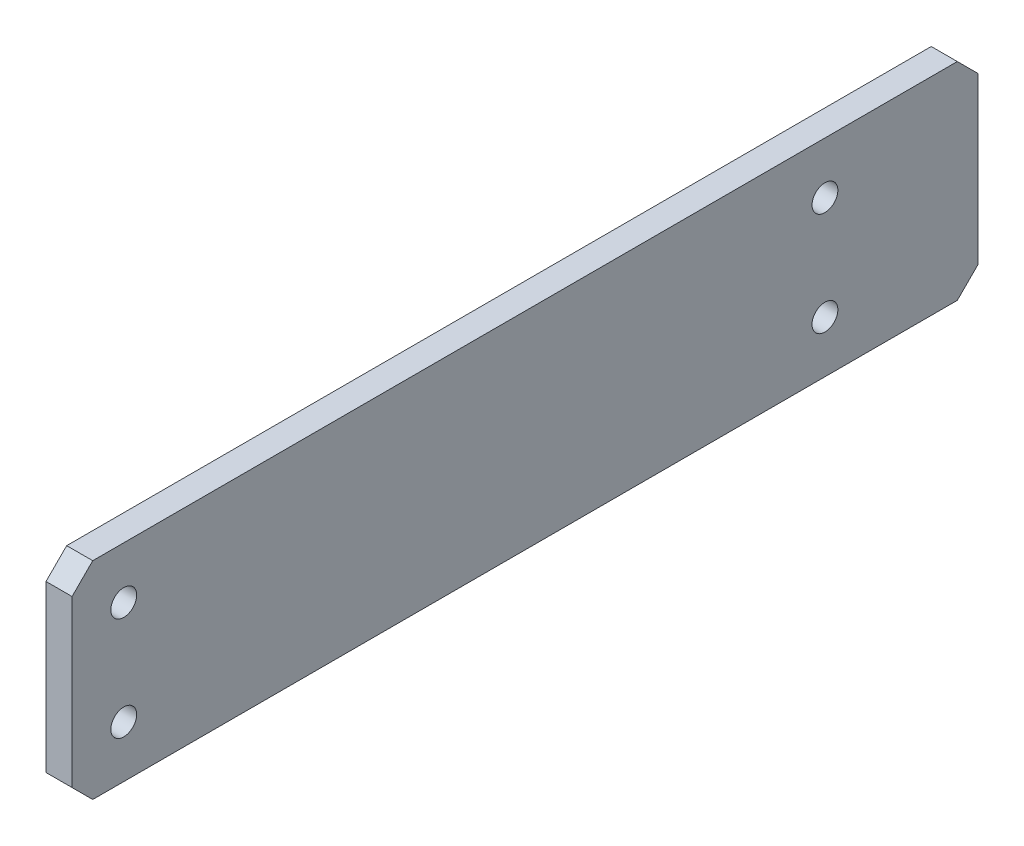
ISO-10303-21;
HEADER;
FILE_DESCRIPTION(('STEP AP214'),'2;1');
FILE_NAME('part.step','',(''),(''),'','','');
FILE_SCHEMA(('AUTOMOTIVE_DESIGN { 1 0 10303 214 1 1 1 1 }'));
ENDSEC;
DATA;
#1=APPLICATION_CONTEXT('core data for automotive mechanical design processes');
#2=APPLICATION_PROTOCOL_DEFINITION('international standard','automotive_design',2000,#1);
#3=PRODUCT_CONTEXT('',#1,'mechanical');
#4=PRODUCT('Part','Part','',(#3));
#5=PRODUCT_RELATED_PRODUCT_CATEGORY('part','',(#4));
#6=PRODUCT_DEFINITION_FORMATION('','',#4);
#7=PRODUCT_DEFINITION_CONTEXT('part definition',#1,'design');
#8=PRODUCT_DEFINITION('design','',#6,#7);
#9=PRODUCT_DEFINITION_SHAPE('','',#8);
#10=(LENGTH_UNIT() NAMED_UNIT(*) SI_UNIT(.MILLI.,.METRE.));
#11=(NAMED_UNIT(*) PLANE_ANGLE_UNIT() SI_UNIT($,.RADIAN.));
#12=(NAMED_UNIT(*) SI_UNIT($,.STERADIAN.) SOLID_ANGLE_UNIT());
#13=UNCERTAINTY_MEASURE_WITH_UNIT(LENGTH_MEASURE(1.E-05),#10,'distance_accuracy_value','');
#14=(GEOMETRIC_REPRESENTATION_CONTEXT(3) GLOBAL_UNCERTAINTY_ASSIGNED_CONTEXT((#13)) GLOBAL_UNIT_ASSIGNED_CONTEXT((#10,
#11,#12)) REPRESENTATION_CONTEXT('',''));
#15=CARTESIAN_POINT('',(0.,0.,0.));
#16=DIRECTION('',(0.,0.,1.));
#17=DIRECTION('',(1.,0.,0.));
#18=AXIS2_PLACEMENT_3D('',#15,#16,#17);
#19=CARTESIAN_POINT('',(5.588,0.,1.9558));
#20=DIRECTION('',(0.,-1.,0.));
#21=DIRECTION('',(-1.,0.,0.));
#22=AXIS2_PLACEMENT_3D('',#19,#20,#21);
#23=PLANE('',#22);
#24=DIRECTION('',(0.,0.,-1.));
#25=VECTOR('',#24,1.);
#26=CARTESIAN_POINT('',(7.9502,0.,9.906));
#27=LINE('',#26,#25);
#28=CARTESIAN_POINT('',(7.9502,0.,8.63599999999999));
#29=VERTEX_POINT('',#28);
#30=CARTESIAN_POINT('',(7.9502,0.,-44.45));
#31=VERTEX_POINT('',#30);
#32=EDGE_CURVE('E195',#29,#31,#27,.T.);
#33=ORIENTED_EDGE('',*,*,#32,.F.);
#34=DIRECTION('',(-1.,0.,0.));
#35=VECTOR('',#34,1.);
#36=CARTESIAN_POINT('',(5.588,0.,8.63599999999999));
#37=LINE('',#36,#35);
#38=CARTESIAN_POINT('',(6.35,0.,8.63599999999999));
#39=VERTEX_POINT('',#38);
#40=EDGE_CURVE('E206',#29,#39,#37,.T.);
#41=ORIENTED_EDGE('',*,*,#40,.T.);
#42=DIRECTION('',(0.,0.,-1.));
#43=VECTOR('',#42,1.);
#44=CARTESIAN_POINT('',(6.35,0.,9.906));
#45=LINE('',#44,#43);
#46=CARTESIAN_POINT('',(6.35,0.,-44.45));
#47=VERTEX_POINT('',#46);
#48=EDGE_CURVE('E180',#39,#47,#45,.T.);
#49=ORIENTED_EDGE('',*,*,#48,.T.);
#50=DIRECTION('',(1.,0.,0.));
#51=VECTOR('',#50,1.);
#52=CARTESIAN_POINT('',(5.588,0.,-44.45));
#53=LINE('',#52,#51);
#54=EDGE_CURVE('E193',#47,#31,#53,.T.);
#55=ORIENTED_EDGE('',*,*,#54,.T.);
#56=EDGE_LOOP('',(#33,#41,#49,#55));
#57=FACE_BOUND('',#56,.T.);
#58=ADVANCED_FACE('F51',(#57),#23,.T.);
#59=CARTESIAN_POINT('',(6.35,12.7,0.));
#60=DIRECTION('',(-1.,0.,0.));
#61=DIRECTION('',(0.,0.,1.));
#62=AXIS2_PLACEMENT_3D('',#59,#60,#61);
#63=PLANE('',#62);
#64=CARTESIAN_POINT('',(6.35,9.525,6.731));
#65=DIRECTION('',(-1.,0.,0.));
#66=DIRECTION('',(0.,0.,1.));
#67=AXIS2_PLACEMENT_3D('',#64,#65,#66);
#68=CIRCLE('',#67,0.793749999999999);
#69=CARTESIAN_POINT('',(6.35,9.525,7.52475));
#70=VERTEX_POINT('',#69);
#71=EDGE_CURVE('E181',#70,#70,#68,.T.);
#72=ORIENTED_EDGE('',*,*,#71,.F.);
#73=EDGE_LOOP('',(#72));
#74=FACE_BOUND('',#73,.T.);
#75=CARTESIAN_POINT('',(6.35,3.175,6.731));
#76=DIRECTION('',(-1.,0.,0.));
#77=DIRECTION('',(0.,0.,1.));
#78=AXIS2_PLACEMENT_3D('',#75,#76,#77);
#79=CIRCLE('',#78,0.793750000000001);
#80=CARTESIAN_POINT('',(6.35,3.175,7.52475));
#81=VERTEX_POINT('',#80);
#82=EDGE_CURVE('E185',#81,#81,#79,.T.);
#83=ORIENTED_EDGE('',*,*,#82,.F.);
#84=EDGE_LOOP('',(#83));
#85=FACE_BOUND('',#84,.T.);
#86=DIRECTION('',(0.,-1.,0.));
#87=VECTOR('',#86,1.);
#88=CARTESIAN_POINT('',(6.35,12.7,9.906));
#89=LINE('',#88,#87);
#90=CARTESIAN_POINT('',(6.35,11.43,9.906));
#91=VERTEX_POINT('',#90);
#92=CARTESIAN_POINT('',(6.35,1.27000000000001,9.906));
#93=VERTEX_POINT('',#92);
#94=EDGE_CURVE('E203',#91,#93,#89,.T.);
#95=ORIENTED_EDGE('',*,*,#94,.F.);
#96=DIRECTION('',(0.,0.707106781186548,-0.707106781186547));
#97=VECTOR('',#96,1.);
#98=CARTESIAN_POINT('',(6.35,12.065,9.271));
#99=LINE('',#98,#97);
#100=CARTESIAN_POINT('',(6.35,12.7,8.63599999999999));
#101=VERTEX_POINT('',#100);
#102=EDGE_CURVE('E74',#91,#101,#99,.T.);
#103=ORIENTED_EDGE('',*,*,#102,.T.);
#104=DIRECTION('',(0.,0.,-1.));
#105=VECTOR('',#104,1.);
#106=CARTESIAN_POINT('',(6.35,12.7,9.906));
#107=LINE('',#106,#105);
#108=CARTESIAN_POINT('',(6.35,12.7,-44.45));
#109=VERTEX_POINT('',#108);
#110=EDGE_CURVE('E123',#101,#109,#107,.T.);
#111=ORIENTED_EDGE('',*,*,#110,.T.);
#112=DIRECTION('',(0.,0.707106781186549,0.707106781186547));
#113=VECTOR('',#112,1.);
#114=CARTESIAN_POINT('',(6.35,34.925,-22.2250000000001));
#115=LINE('',#114,#113);
#116=CARTESIAN_POINT('',(6.35,11.43,-45.72));
#117=VERTEX_POINT('',#116);
#118=EDGE_CURVE('E139',#109,#117,#115,.F.);
#119=ORIENTED_EDGE('',*,*,#118,.T.);
#120=DIRECTION('',(0.,-1.,0.));
#121=VECTOR('',#120,1.);
#122=CARTESIAN_POINT('',(6.35,12.7,-45.72));
#123=LINE('',#122,#121);
#124=CARTESIAN_POINT('',(6.35,1.27000000000001,-45.72));
#125=VERTEX_POINT('',#124);
#126=EDGE_CURVE('E151',#117,#125,#123,.T.);
#127=ORIENTED_EDGE('',*,*,#126,.T.);
#128=DIRECTION('',(0.,0.707106781186549,-0.707106781186547));
#129=VECTOR('',#128,1.);
#130=CARTESIAN_POINT('',(6.35,-15.875,-28.5750000000001));
#131=LINE('',#130,#129);
#132=EDGE_CURVE('E142',#125,#47,#131,.F.);
#133=ORIENTED_EDGE('',*,*,#132,.T.);
#134=ORIENTED_EDGE('',*,*,#48,.F.);
#135=DIRECTION('',(0.,-0.707106781186548,-0.707106781186548));
#136=VECTOR('',#135,1.);
#137=CARTESIAN_POINT('',(6.35,6.985,15.621));
#138=LINE('',#137,#136);
#139=EDGE_CURVE('E210',#39,#93,#138,.F.);
#140=ORIENTED_EDGE('',*,*,#139,.T.);
#141=EDGE_LOOP('',(#95,#103,#111,#119,#127,#133,#134,#140));
#142=FACE_BOUND('',#141,.T.);
#143=CARTESIAN_POINT('',(6.35,9.525,-36.322));
#144=DIRECTION('',(-1.,0.,0.));
#145=DIRECTION('',(0.,0.,1.));
#146=AXIS2_PLACEMENT_3D('',#143,#144,#145);
#147=CIRCLE('',#146,0.793749999999993);
#148=CARTESIAN_POINT('',(6.35,9.525,-35.52825));
#149=VERTEX_POINT('',#148);
#150=EDGE_CURVE('E159',#149,#149,#147,.T.);
#151=ORIENTED_EDGE('',*,*,#150,.F.);
#152=EDGE_LOOP('',(#151));
#153=FACE_BOUND('',#152,.T.);
#154=CARTESIAN_POINT('',(6.35,3.175,-36.322));
#155=DIRECTION('',(-1.,0.,0.));
#156=DIRECTION('',(0.,0.,1.));
#157=AXIS2_PLACEMENT_3D('',#154,#155,#156);
#158=CIRCLE('',#157,0.79375);
#159=CARTESIAN_POINT('',(6.35,3.175,-35.52825));
#160=VERTEX_POINT('',#159);
#161=EDGE_CURVE('E163',#160,#160,#158,.T.);
#162=ORIENTED_EDGE('',*,*,#161,.F.);
#163=EDGE_LOOP('',(#162));
#164=FACE_BOUND('',#163,.T.);
#165=ADVANCED_FACE('F53',(#74,#85,#142,#153,#164),#63,.T.);
#166=CARTESIAN_POINT('',(7.9502,12.7,9.906));
#167=DIRECTION('',(0.,0.,1.));
#168=DIRECTION('',(1.,0.,0.));
#169=AXIS2_PLACEMENT_3D('',#166,#167,#168);
#170=PLANE('',#169);
#171=DIRECTION('',(0.,-1.,0.));
#172=VECTOR('',#171,1.);
#173=CARTESIAN_POINT('',(7.9502,12.7,9.906));
#174=LINE('',#173,#172);
#175=CARTESIAN_POINT('',(7.9502,11.43,9.906));
#176=VERTEX_POINT('',#175);
#177=CARTESIAN_POINT('',(7.9502,1.27000000000001,9.906));
#178=VERTEX_POINT('',#177);
#179=EDGE_CURVE('E122',#176,#178,#174,.T.);
#180=ORIENTED_EDGE('',*,*,#179,.F.);
#181=DIRECTION('',(-1.,0.,0.));
#182=VECTOR('',#181,1.);
#183=CARTESIAN_POINT('',(6.35,11.43,9.906));
#184=LINE('',#183,#182);
#185=EDGE_CURVE('E221',#176,#91,#184,.T.);
#186=ORIENTED_EDGE('',*,*,#185,.T.);
#187=ORIENTED_EDGE('',*,*,#94,.T.);
#188=DIRECTION('',(1.,0.,0.));
#189=VECTOR('',#188,1.);
#190=CARTESIAN_POINT('',(7.9502,1.27000000000001,9.906));
#191=LINE('',#190,#189);
#192=EDGE_CURVE('E214',#93,#178,#191,.T.);
#193=ORIENTED_EDGE('',*,*,#192,.T.);
#194=EDGE_LOOP('',(#180,#186,#187,#193));
#195=FACE_BOUND('',#194,.T.);
#196=ADVANCED_FACE('F307',(#195),#170,.T.);
#197=CARTESIAN_POINT('',(7.9502,12.7,9.906));
#198=DIRECTION('',(-1.,0.,0.));
#199=DIRECTION('',(0.,0.,1.));
#200=AXIS2_PLACEMENT_3D('',#197,#198,#199);
#201=PLANE('',#200);
#202=CARTESIAN_POINT('',(7.9502,9.525,6.731));
#203=DIRECTION('',(-1.,0.,0.));
#204=DIRECTION('',(0.,0.,1.));
#205=AXIS2_PLACEMENT_3D('',#202,#203,#204);
#206=CIRCLE('',#205,0.793749999999999);
#207=CARTESIAN_POINT('',(7.9502,9.525,7.52475));
#208=VERTEX_POINT('',#207);
#209=EDGE_CURVE('E176',#208,#208,#206,.T.);
#210=ORIENTED_EDGE('',*,*,#209,.T.);
#211=EDGE_LOOP('',(#210));
#212=FACE_BOUND('',#211,.T.);
#213=CARTESIAN_POINT('',(7.9502,3.175,6.731));
#214=DIRECTION('',(-1.,0.,0.));
#215=DIRECTION('',(0.,0.,1.));
#216=AXIS2_PLACEMENT_3D('',#213,#214,#215);
#217=CIRCLE('',#216,0.793750000000001);
#218=CARTESIAN_POINT('',(7.9502,3.175,7.52475));
#219=VERTEX_POINT('',#218);
#220=EDGE_CURVE('E189',#219,#219,#217,.T.);
#221=ORIENTED_EDGE('',*,*,#220,.T.);
#222=EDGE_LOOP('',(#221));
#223=FACE_BOUND('',#222,.T.);
#224=DIRECTION('',(0.,0.,-1.));
#225=VECTOR('',#224,1.);
#226=CARTESIAN_POINT('',(7.9502,12.7,9.906));
#227=LINE('',#226,#225);
#228=CARTESIAN_POINT('',(7.9502,12.7,8.63599999999999));
#229=VERTEX_POINT('',#228);
#230=CARTESIAN_POINT('',(7.9502,12.7,-44.45));
#231=VERTEX_POINT('',#230);
#232=EDGE_CURVE('E113',#229,#231,#227,.T.);
#233=ORIENTED_EDGE('',*,*,#232,.F.);
#234=DIRECTION('',(0.,-0.707106781186548,0.707106781186547));
#235=VECTOR('',#234,1.);
#236=CARTESIAN_POINT('',(7.9502,11.43,9.906));
#237=LINE('',#236,#235);
#238=EDGE_CURVE('E12',#229,#176,#237,.T.);
#239=ORIENTED_EDGE('',*,*,#238,.T.);
#240=ORIENTED_EDGE('',*,*,#179,.T.);
#241=DIRECTION('',(0.,0.707106781186548,0.707106781186548));
#242=VECTOR('',#241,1.);
#243=CARTESIAN_POINT('',(7.9502,0.,8.63599999999999));
#244=LINE('',#243,#242);
#245=EDGE_CURVE('E218',#178,#29,#244,.F.);
#246=ORIENTED_EDGE('',*,*,#245,.T.);
#247=ORIENTED_EDGE('',*,*,#32,.T.);
#248=DIRECTION('',(0.,-0.707106781186549,0.707106781186547));
#249=VECTOR('',#248,1.);
#250=CARTESIAN_POINT('',(7.9502,0.,-44.45));
#251=LINE('',#250,#249);
#252=CARTESIAN_POINT('',(7.9502,1.27000000000001,-45.72));
#253=VERTEX_POINT('',#252);
#254=EDGE_CURVE('E135',#31,#253,#251,.F.);
#255=ORIENTED_EDGE('',*,*,#254,.T.);
#256=DIRECTION('',(0.,-1.,0.));
#257=VECTOR('',#256,1.);
#258=CARTESIAN_POINT('',(7.9502,12.7,-45.72));
#259=LINE('',#258,#257);
#260=CARTESIAN_POINT('',(7.9502,11.43,-45.72));
#261=VERTEX_POINT('',#260);
#262=EDGE_CURVE('E130',#261,#253,#259,.T.);
#263=ORIENTED_EDGE('',*,*,#262,.F.);
#264=DIRECTION('',(0.,-0.707106781186549,-0.707106781186547));
#265=VECTOR('',#264,1.);
#266=CARTESIAN_POINT('',(7.9502,11.43,-45.72));
#267=LINE('',#266,#265);
#268=EDGE_CURVE('E126',#261,#231,#267,.F.);
#269=ORIENTED_EDGE('',*,*,#268,.T.);
#270=EDGE_LOOP('',(#233,#239,#240,#246,#247,#255,#263,#269));
#271=FACE_BOUND('',#270,.T.);
#272=CARTESIAN_POINT('',(7.9502,9.525,-36.322));
#273=DIRECTION('',(-1.,0.,0.));
#274=DIRECTION('',(0.,0.,1.));
#275=AXIS2_PLACEMENT_3D('',#272,#273,#274);
#276=CIRCLE('',#275,0.793749999999993);
#277=CARTESIAN_POINT('',(7.9502,9.525,-35.52825));
#278=VERTEX_POINT('',#277);
#279=EDGE_CURVE('E141',#278,#278,#276,.T.);
#280=ORIENTED_EDGE('',*,*,#279,.T.);
#281=EDGE_LOOP('',(#280));
#282=FACE_BOUND('',#281,.T.);
#283=CARTESIAN_POINT('',(7.9502,3.175,-36.322));
#284=DIRECTION('',(-1.,0.,0.));
#285=DIRECTION('',(0.,0.,1.));
#286=AXIS2_PLACEMENT_3D('',#283,#284,#285);
#287=CIRCLE('',#286,0.79375);
#288=CARTESIAN_POINT('',(7.9502,3.175,-35.52825));
#289=VERTEX_POINT('',#288);
#290=EDGE_CURVE('E136',#289,#289,#287,.T.);
#291=ORIENTED_EDGE('',*,*,#290,.T.);
#292=EDGE_LOOP('',(#291));
#293=FACE_BOUND('',#292,.T.);
#294=ADVANCED_FACE('F127',(#212,#223,#271,#282,#293),#201,.F.);
#295=CARTESIAN_POINT('',(5.588,12.7,4.318));
#296=DIRECTION('',(0.,-1.,0.));
#297=DIRECTION('',(0.,0.,1.));
#298=AXIS2_PLACEMENT_3D('',#295,#296,#297);
#299=PLANE('',#298);
#300=ORIENTED_EDGE('',*,*,#110,.F.);
#301=DIRECTION('',(1.,0.,0.));
#302=VECTOR('',#301,1.);
#303=CARTESIAN_POINT('',(7.9502,12.7,8.63599999999999));
#304=LINE('',#303,#302);
#305=EDGE_CURVE('E60',#101,#229,#304,.T.);
#306=ORIENTED_EDGE('',*,*,#305,.T.);
#307=ORIENTED_EDGE('',*,*,#232,.T.);
#308=DIRECTION('',(-1.,0.,0.));
#309=VECTOR('',#308,1.);
#310=CARTESIAN_POINT('',(5.588,12.7,-44.45));
#311=LINE('',#310,#309);
#312=EDGE_CURVE('E117',#231,#109,#311,.T.);
#313=ORIENTED_EDGE('',*,*,#312,.T.);
#314=EDGE_LOOP('',(#300,#306,#307,#313));
#315=FACE_BOUND('',#314,.T.);
#316=ADVANCED_FACE('F115',(#315),#299,.F.);
#317=CARTESIAN_POINT('',(7.9502,3.175,6.731));
#318=DIRECTION('',(-1.,0.,0.));
#319=DIRECTION('',(0.,0.,1.));
#320=AXIS2_PLACEMENT_3D('',#317,#318,#319);
#321=CYLINDRICAL_SURFACE('',#320,0.793750000000001);
#322=ORIENTED_EDGE('',*,*,#220,.F.);
#323=EDGE_LOOP('',(#322));
#324=FACE_BOUND('',#323,.T.);
#325=ORIENTED_EDGE('',*,*,#82,.T.);
#326=EDGE_LOOP('',(#325));
#327=FACE_BOUND('',#326,.T.);
#328=ADVANCED_FACE('F335',(#324,#327),#321,.F.);
#329=CARTESIAN_POINT('',(7.9502,9.525,6.731));
#330=DIRECTION('',(-1.,0.,0.));
#331=DIRECTION('',(0.,0.,1.));
#332=AXIS2_PLACEMENT_3D('',#329,#330,#331);
#333=CYLINDRICAL_SURFACE('',#332,0.793749999999999);
#334=ORIENTED_EDGE('',*,*,#209,.F.);
#335=EDGE_LOOP('',(#334));
#336=FACE_BOUND('',#335,.T.);
#337=ORIENTED_EDGE('',*,*,#71,.T.);
#338=EDGE_LOOP('',(#337));
#339=FACE_BOUND('',#338,.T.);
#340=ADVANCED_FACE('F331',(#336,#339),#333,.F.);
#341=CARTESIAN_POINT('',(5.588,0.,8.63599999999999));
#342=DIRECTION('',(0.,0.707106781186548,-0.707106781186548));
#343=DIRECTION('',(-1.,0.,0.));
#344=AXIS2_PLACEMENT_3D('',#341,#342,#343);
#345=PLANE('',#344);
#346=ORIENTED_EDGE('',*,*,#245,.F.);
#347=ORIENTED_EDGE('',*,*,#192,.F.);
#348=ORIENTED_EDGE('',*,*,#139,.F.);
#349=ORIENTED_EDGE('',*,*,#40,.F.);
#350=EDGE_LOOP('',(#346,#347,#348,#349));
#351=FACE_BOUND('',#350,.T.);
#352=ADVANCED_FACE('F334',(#351),#345,.F.);
#353=CARTESIAN_POINT('',(7.9502,11.43,9.906));
#354=DIRECTION('',(0.,0.707106781186547,0.707106781186548));
#355=DIRECTION('',(1.,0.,0.));
#356=AXIS2_PLACEMENT_3D('',#353,#354,#355);
#357=PLANE('',#356);
#358=ORIENTED_EDGE('',*,*,#238,.F.);
#359=ORIENTED_EDGE('',*,*,#305,.F.);
#360=ORIENTED_EDGE('',*,*,#102,.F.);
#361=ORIENTED_EDGE('',*,*,#185,.F.);
#362=EDGE_LOOP('',(#358,#359,#360,#361));
#363=FACE_BOUND('',#362,.T.);
#364=ADVANCED_FACE('F351',(#363),#357,.T.);
#365=CARTESIAN_POINT('',(5.588,0.,-44.45));
#366=DIRECTION('',(0.,0.707106781186547,0.707106781186549));
#367=DIRECTION('',(1.,0.,0.));
#368=AXIS2_PLACEMENT_3D('',#365,#366,#367);
#369=PLANE('',#368);
#370=ORIENTED_EDGE('',*,*,#132,.F.);
#371=DIRECTION('',(-1.,0.,0.));
#372=VECTOR('',#371,1.);
#373=CARTESIAN_POINT('',(6.35,1.27000000000001,-45.72));
#374=LINE('',#373,#372);
#375=EDGE_CURVE('E167',#253,#125,#374,.T.);
#376=ORIENTED_EDGE('',*,*,#375,.F.);
#377=ORIENTED_EDGE('',*,*,#254,.F.);
#378=ORIENTED_EDGE('',*,*,#54,.F.);
#379=EDGE_LOOP('',(#370,#376,#377,#378));
#380=FACE_BOUND('',#379,.T.);
#381=ADVANCED_FACE('F356',(#380),#369,.F.);
#382=CARTESIAN_POINT('',(6.35,12.7,-45.72));
#383=DIRECTION('',(0.,0.,-1.));
#384=DIRECTION('',(-1.,0.,0.));
#385=AXIS2_PLACEMENT_3D('',#382,#383,#384);
#386=PLANE('',#385);
#387=ORIENTED_EDGE('',*,*,#126,.F.);
#388=DIRECTION('',(1.,0.,0.));
#389=VECTOR('',#388,1.);
#390=CARTESIAN_POINT('',(6.35,11.43,-45.72));
#391=LINE('',#390,#389);
#392=EDGE_CURVE('E173',#117,#261,#391,.T.);
#393=ORIENTED_EDGE('',*,*,#392,.T.);
#394=ORIENTED_EDGE('',*,*,#262,.T.);
#395=ORIENTED_EDGE('',*,*,#375,.T.);
#396=EDGE_LOOP('',(#387,#393,#394,#395));
#397=FACE_BOUND('',#396,.T.);
#398=ADVANCED_FACE('F361',(#397),#386,.T.);
#399=CARTESIAN_POINT('',(6.35,11.43,-45.72));
#400=DIRECTION('',(0.,-0.707106781186547,0.707106781186549));
#401=DIRECTION('',(1.,0.,0.));
#402=AXIS2_PLACEMENT_3D('',#399,#400,#401);
#403=PLANE('',#402);
#404=ORIENTED_EDGE('',*,*,#118,.F.);
#405=ORIENTED_EDGE('',*,*,#312,.F.);
#406=ORIENTED_EDGE('',*,*,#268,.F.);
#407=ORIENTED_EDGE('',*,*,#392,.F.);
#408=EDGE_LOOP('',(#404,#405,#406,#407));
#409=FACE_BOUND('',#408,.T.);
#410=ADVANCED_FACE('F138',(#409),#403,.F.);
#411=CARTESIAN_POINT('',(7.9502,3.175,-36.322));
#412=DIRECTION('',(-1.,0.,0.));
#413=DIRECTION('',(0.,0.,1.));
#414=AXIS2_PLACEMENT_3D('',#411,#412,#413);
#415=CYLINDRICAL_SURFACE('',#414,0.79375);
#416=CARTESIAN_POINT('',(7.9502,3.175,-35.52825));
#417=CARTESIAN_POINT('',(7.93353125,3.175,-35.52825));
#418=CARTESIAN_POINT('',(7.9168625,3.175,-35.52825));
#419=CARTESIAN_POINT('',(7.883525,3.175,-35.52825));
#420=CARTESIAN_POINT('',(7.86685625,3.175,-35.52825));
#421=CARTESIAN_POINT('',(7.83351875,3.175,-35.52825));
#422=CARTESIAN_POINT('',(7.81685,3.175,-35.52825));
#423=CARTESIAN_POINT('',(7.7835125,3.175,-35.52825));
#424=CARTESIAN_POINT('',(7.76684375,3.175,-35.52825));
#425=CARTESIAN_POINT('',(7.73350625,3.175,-35.52825));
#426=CARTESIAN_POINT('',(7.7168375,3.175,-35.52825));
#427=CARTESIAN_POINT('',(7.6835,3.175,-35.52825));
#428=CARTESIAN_POINT('',(7.66683125,3.175,-35.52825));
#429=CARTESIAN_POINT('',(7.63349375,3.175,-35.52825));
#430=CARTESIAN_POINT('',(7.616825,3.175,-35.52825));
#431=CARTESIAN_POINT('',(7.5834875,3.175,-35.52825));
#432=CARTESIAN_POINT('',(7.56681875,3.175,-35.52825));
#433=CARTESIAN_POINT('',(7.53348125,3.175,-35.52825));
#434=CARTESIAN_POINT('',(7.5168125,3.175,-35.52825));
#435=CARTESIAN_POINT('',(7.483475,3.175,-35.52825));
#436=CARTESIAN_POINT('',(7.46680625,3.175,-35.52825));
#437=CARTESIAN_POINT('',(7.43346875,3.175,-35.52825));
#438=CARTESIAN_POINT('',(7.4168,3.175,-35.52825));
#439=CARTESIAN_POINT('',(7.3834625,3.175,-35.52825));
#440=CARTESIAN_POINT('',(7.36679375,3.175,-35.52825));
#441=CARTESIAN_POINT('',(7.33345625,3.175,-35.52825));
#442=CARTESIAN_POINT('',(7.3167875,3.175,-35.52825));
#443=CARTESIAN_POINT('',(7.28345,3.175,-35.52825));
#444=CARTESIAN_POINT('',(7.26678125,3.175,-35.52825));
#445=CARTESIAN_POINT('',(7.23344375,3.175,-35.52825));
#446=CARTESIAN_POINT('',(7.216775,3.175,-35.52825));
#447=CARTESIAN_POINT('',(7.1834375,3.175,-35.52825));
#448=CARTESIAN_POINT('',(7.16676875,3.175,-35.52825));
#449=CARTESIAN_POINT('',(7.13343125,3.175,-35.52825));
#450=CARTESIAN_POINT('',(7.1167625,3.175,-35.52825));
#451=CARTESIAN_POINT('',(7.083425,3.175,-35.52825));
#452=CARTESIAN_POINT('',(7.06675625,3.175,-35.52825));
#453=CARTESIAN_POINT('',(7.03341875,3.175,-35.52825));
#454=CARTESIAN_POINT('',(7.01675,3.175,-35.52825));
#455=CARTESIAN_POINT('',(6.9834125,3.175,-35.52825));
#456=CARTESIAN_POINT('',(6.96674375,3.175,-35.52825));
#457=CARTESIAN_POINT('',(6.93340625,3.175,-35.52825));
#458=CARTESIAN_POINT('',(6.9167375,3.175,-35.52825));
#459=CARTESIAN_POINT('',(6.8834,3.175,-35.52825));
#460=CARTESIAN_POINT('',(6.86673125,3.175,-35.52825));
#461=CARTESIAN_POINT('',(6.83339375,3.175,-35.52825));
#462=CARTESIAN_POINT('',(6.816725,3.175,-35.52825));
#463=CARTESIAN_POINT('',(6.7833875,3.175,-35.52825));
#464=CARTESIAN_POINT('',(6.76671875,3.175,-35.52825));
#465=CARTESIAN_POINT('',(6.73338125,3.175,-35.52825));
#466=CARTESIAN_POINT('',(6.7167125,3.175,-35.52825));
#467=CARTESIAN_POINT('',(6.683375,3.175,-35.52825));
#468=CARTESIAN_POINT('',(6.66670625,3.175,-35.52825));
#469=CARTESIAN_POINT('',(6.63336875,3.175,-35.52825));
#470=CARTESIAN_POINT('',(6.6167,3.175,-35.52825));
#471=CARTESIAN_POINT('',(6.5833625,3.175,-35.52825));
#472=CARTESIAN_POINT('',(6.56669375,3.175,-35.52825));
#473=CARTESIAN_POINT('',(6.53335625,3.175,-35.52825));
#474=CARTESIAN_POINT('',(6.5166875,3.175,-35.52825));
#475=CARTESIAN_POINT('',(6.48335,3.175,-35.52825));
#476=CARTESIAN_POINT('',(6.46668125,3.175,-35.52825));
#477=CARTESIAN_POINT('',(6.43334375,3.175,-35.52825));
#478=CARTESIAN_POINT('',(6.416675,3.175,-35.52825));
#479=CARTESIAN_POINT('',(6.3833375,3.175,-35.52825));
#480=CARTESIAN_POINT('',(6.36666875,3.175,-35.52825));
#481=CARTESIAN_POINT('',(6.35,3.175,-35.52825));
#482=B_SPLINE_CURVE_WITH_KNOTS('',3,(#416,#417,#418,#419,#420,#421,#422,#423,#424,#425,#426,
#427,#428,#429,#430,#431,#432,#433,#434,#435,#436,#437,#438,#439,#440,#441,#442,#443,#444,#445,
#446,#447,#448,#449,#450,#451,#452,#453,#454,#455,#456,#457,#458,#459,#460,#461,#462,#463,#464,
#465,#466,#467,#468,#469,#470,#471,#472,#473,#474,#475,#476,#477,#478,#479,#480,#481),
.UNSPECIFIED.,.F.,.F.,(4,2,2,2,2,2,2,2,2,2,2,2,2,2,2,2,2,2,2,2,2,2,2,2,2,2,2,2,2,2,2,2,4),(0.,
0.0500062499999999,0.1000125,0.15001875,0.200025,0.250031249999999,0.300037499999999,
0.350043749999999,0.40005,0.45005625,0.5000625,0.55006875,0.600074999999999,0.65008125,
0.7000875,0.75009375,0.8001,0.85010625,0.9001125,0.95011875,1.000125,1.05013125,1.1001375,
1.15014375,1.20015,1.25015625,1.3001625,1.35016875,1.400175,1.45018125,1.5001875,1.55019375,
1.6002),.UNSPECIFIED.);
#483=EDGE_CURVE('BSEAM299',#289,#160,#482,.T.);
#484=ORIENTED_EDGE('',*,*,#290,.F.);
#485=ORIENTED_EDGE('',*,*,#161,.T.);
#486=ORIENTED_EDGE('',*,*,#483,.T.);
#487=ORIENTED_EDGE('',*,*,#483,.F.);
#488=EDGE_LOOP('',(#484,#486,#485,#487));
#489=FACE_BOUND('',#488,.T.);
#490=ADVANCED_FACE('F299',(#489),#415,.F.);
#491=CARTESIAN_POINT('',(7.9502,9.525,-36.322));
#492=DIRECTION('',(-1.,0.,0.));
#493=DIRECTION('',(0.,0.,1.));
#494=AXIS2_PLACEMENT_3D('',#491,#492,#493);
#495=CYLINDRICAL_SURFACE('',#494,0.793749999999993);
#496=CARTESIAN_POINT('',(7.9502,9.525,-35.52825));
#497=CARTESIAN_POINT('',(7.93353125,9.525,-35.52825));
#498=CARTESIAN_POINT('',(7.9168625,9.525,-35.52825));
#499=CARTESIAN_POINT('',(7.883525,9.525,-35.52825));
#500=CARTESIAN_POINT('',(7.86685625,9.525,-35.52825));
#501=CARTESIAN_POINT('',(7.83351875,9.525,-35.52825));
#502=CARTESIAN_POINT('',(7.81685,9.525,-35.52825));
#503=CARTESIAN_POINT('',(7.7835125,9.525,-35.52825));
#504=CARTESIAN_POINT('',(7.76684375,9.525,-35.52825));
#505=CARTESIAN_POINT('',(7.73350625,9.525,-35.52825));
#506=CARTESIAN_POINT('',(7.7168375,9.525,-35.52825));
#507=CARTESIAN_POINT('',(7.6835,9.525,-35.52825));
#508=CARTESIAN_POINT('',(7.66683125,9.525,-35.52825));
#509=CARTESIAN_POINT('',(7.63349375,9.525,-35.52825));
#510=CARTESIAN_POINT('',(7.616825,9.525,-35.52825));
#511=CARTESIAN_POINT('',(7.5834875,9.525,-35.52825));
#512=CARTESIAN_POINT('',(7.56681875,9.525,-35.52825));
#513=CARTESIAN_POINT('',(7.53348125,9.525,-35.52825));
#514=CARTESIAN_POINT('',(7.5168125,9.525,-35.52825));
#515=CARTESIAN_POINT('',(7.483475,9.525,-35.52825));
#516=CARTESIAN_POINT('',(7.46680625,9.525,-35.52825));
#517=CARTESIAN_POINT('',(7.43346875,9.525,-35.52825));
#518=CARTESIAN_POINT('',(7.4168,9.525,-35.52825));
#519=CARTESIAN_POINT('',(7.3834625,9.525,-35.52825));
#520=CARTESIAN_POINT('',(7.36679375,9.525,-35.52825));
#521=CARTESIAN_POINT('',(7.33345625,9.525,-35.52825));
#522=CARTESIAN_POINT('',(7.3167875,9.525,-35.52825));
#523=CARTESIAN_POINT('',(7.28345,9.525,-35.52825));
#524=CARTESIAN_POINT('',(7.26678125,9.525,-35.52825));
#525=CARTESIAN_POINT('',(7.23344375,9.525,-35.52825));
#526=CARTESIAN_POINT('',(7.216775,9.525,-35.52825));
#527=CARTESIAN_POINT('',(7.1834375,9.525,-35.52825));
#528=CARTESIAN_POINT('',(7.16676875,9.525,-35.52825));
#529=CARTESIAN_POINT('',(7.13343125,9.525,-35.52825));
#530=CARTESIAN_POINT('',(7.1167625,9.525,-35.52825));
#531=CARTESIAN_POINT('',(7.083425,9.525,-35.52825));
#532=CARTESIAN_POINT('',(7.06675625,9.525,-35.52825));
#533=CARTESIAN_POINT('',(7.03341875,9.525,-35.52825));
#534=CARTESIAN_POINT('',(7.01675,9.525,-35.52825));
#535=CARTESIAN_POINT('',(6.9834125,9.525,-35.52825));
#536=CARTESIAN_POINT('',(6.96674375,9.525,-35.52825));
#537=CARTESIAN_POINT('',(6.93340625,9.525,-35.52825));
#538=CARTESIAN_POINT('',(6.9167375,9.525,-35.52825));
#539=CARTESIAN_POINT('',(6.8834,9.525,-35.52825));
#540=CARTESIAN_POINT('',(6.86673125,9.525,-35.52825));
#541=CARTESIAN_POINT('',(6.83339375,9.525,-35.52825));
#542=CARTESIAN_POINT('',(6.816725,9.525,-35.52825));
#543=CARTESIAN_POINT('',(6.7833875,9.525,-35.52825));
#544=CARTESIAN_POINT('',(6.76671875,9.525,-35.52825));
#545=CARTESIAN_POINT('',(6.73338125,9.525,-35.52825));
#546=CARTESIAN_POINT('',(6.7167125,9.525,-35.52825));
#547=CARTESIAN_POINT('',(6.683375,9.525,-35.52825));
#548=CARTESIAN_POINT('',(6.66670625,9.525,-35.52825));
#549=CARTESIAN_POINT('',(6.63336875,9.525,-35.52825));
#550=CARTESIAN_POINT('',(6.6167,9.525,-35.52825));
#551=CARTESIAN_POINT('',(6.5833625,9.525,-35.52825));
#552=CARTESIAN_POINT('',(6.56669375,9.525,-35.52825));
#553=CARTESIAN_POINT('',(6.53335625,9.525,-35.52825));
#554=CARTESIAN_POINT('',(6.5166875,9.525,-35.52825));
#555=CARTESIAN_POINT('',(6.48335,9.525,-35.52825));
#556=CARTESIAN_POINT('',(6.46668125,9.525,-35.52825));
#557=CARTESIAN_POINT('',(6.43334375,9.525,-35.52825));
#558=CARTESIAN_POINT('',(6.416675,9.525,-35.52825));
#559=CARTESIAN_POINT('',(6.3833375,9.525,-35.52825));
#560=CARTESIAN_POINT('',(6.36666875,9.525,-35.52825));
#561=CARTESIAN_POINT('',(6.35,9.525,-35.52825));
#562=B_SPLINE_CURVE_WITH_KNOTS('',3,(#496,#497,#498,#499,#500,#501,#502,#503,#504,#505,#506,
#507,#508,#509,#510,#511,#512,#513,#514,#515,#516,#517,#518,#519,#520,#521,#522,#523,#524,#525,
#526,#527,#528,#529,#530,#531,#532,#533,#534,#535,#536,#537,#538,#539,#540,#541,#542,#543,#544,
#545,#546,#547,#548,#549,#550,#551,#552,#553,#554,#555,#556,#557,#558,#559,#560,#561),
.UNSPECIFIED.,.F.,.F.,(4,2,2,2,2,2,2,2,2,2,2,2,2,2,2,2,2,2,2,2,2,2,2,2,2,2,2,2,2,2,2,2,4),(0.,
0.0500062499999999,0.1000125,0.15001875,0.200025,0.250031249999999,0.300037499999999,
0.350043749999999,0.40005,0.45005625,0.5000625,0.55006875,0.600074999999999,0.65008125,
0.7000875,0.75009375,0.8001,0.85010625,0.9001125,0.95011875,1.000125,1.05013125,1.1001375,
1.15014375,1.20015,1.25015625,1.3001625,1.35016875,1.400175,1.45018125,1.5001875,1.55019375,
1.6002),.UNSPECIFIED.);
#563=EDGE_CURVE('BSEAM302',#278,#149,#562,.T.);
#564=ORIENTED_EDGE('',*,*,#279,.F.);
#565=ORIENTED_EDGE('',*,*,#150,.T.);
#566=ORIENTED_EDGE('',*,*,#563,.T.);
#567=ORIENTED_EDGE('',*,*,#563,.F.);
#568=EDGE_LOOP('',(#564,#566,#565,#567));
#569=FACE_BOUND('',#568,.T.);
#570=ADVANCED_FACE('F302',(#569),#495,.F.);
#571=CLOSED_SHELL('',(#58,#165,#196,#294,#316,#328,#340,#352,#364,#381,#398,#410,#490,#570));
#572=MANIFOLD_SOLID_BREP('B2',#571);
#573=ADVANCED_BREP_SHAPE_REPRESENTATION('',(#18,#572),#14);
#574=SHAPE_DEFINITION_REPRESENTATION(#9,#573);
ENDSEC;
END-ISO-10303-21;
